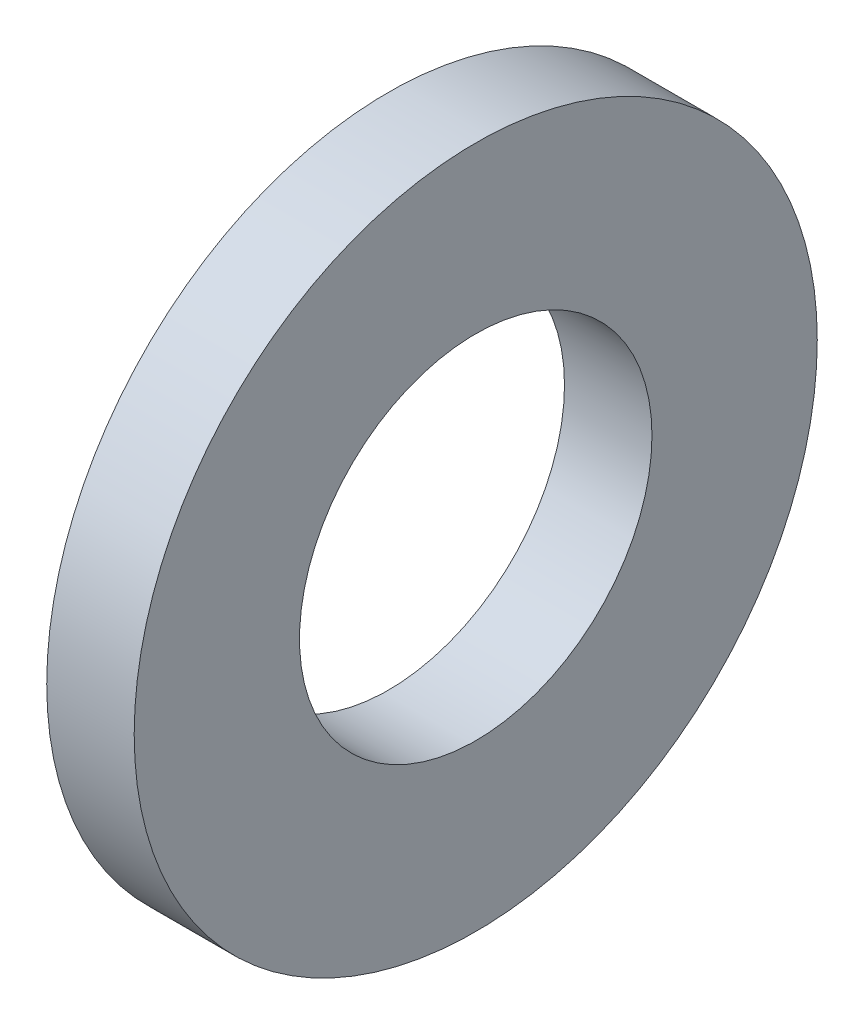
ISO-10303-21;
HEADER;
FILE_DESCRIPTION(('STEP AP214'),'2;1');
FILE_NAME('part.step','',(''),(''),'','','');
FILE_SCHEMA(('AUTOMOTIVE_DESIGN { 1 0 10303 214 1 1 1 1 }'));
ENDSEC;
DATA;
#1=APPLICATION_CONTEXT('core data for automotive mechanical design processes');
#2=APPLICATION_PROTOCOL_DEFINITION('international standard','automotive_design',2000,#1);
#3=PRODUCT_CONTEXT('',#1,'mechanical');
#4=PRODUCT('Part','Part','',(#3));
#5=PRODUCT_RELATED_PRODUCT_CATEGORY('part','',(#4));
#6=PRODUCT_DEFINITION_FORMATION('','',#4);
#7=PRODUCT_DEFINITION_CONTEXT('part definition',#1,'design');
#8=PRODUCT_DEFINITION('design','',#6,#7);
#9=PRODUCT_DEFINITION_SHAPE('','',#8);
#10=(LENGTH_UNIT() NAMED_UNIT(*) SI_UNIT(.MILLI.,.METRE.));
#11=(NAMED_UNIT(*) PLANE_ANGLE_UNIT() SI_UNIT($,.RADIAN.));
#12=(NAMED_UNIT(*) SI_UNIT($,.STERADIAN.) SOLID_ANGLE_UNIT());
#13=UNCERTAINTY_MEASURE_WITH_UNIT(LENGTH_MEASURE(1.E-05),#10,'distance_accuracy_value','');
#14=(GEOMETRIC_REPRESENTATION_CONTEXT(3) GLOBAL_UNCERTAINTY_ASSIGNED_CONTEXT((#13)) GLOBAL_UNIT_ASSIGNED_CONTEXT((#10,
#11,#12)) REPRESENTATION_CONTEXT('',''));
#15=CARTESIAN_POINT('',(0.,0.,0.));
#16=DIRECTION('',(0.,0.,1.));
#17=DIRECTION('',(1.,0.,0.));
#18=AXIS2_PLACEMENT_3D('',#15,#16,#17);
#19=CARTESIAN_POINT('',(1.,0.,0.));
#20=DIRECTION('',(1.,0.,0.));
#21=DIRECTION('',(0.,0.,-1.));
#22=AXIS2_PLACEMENT_3D('',#19,#20,#21);
#23=PLANE('',#22);
#24=CARTESIAN_POINT('',(1.,0.,0.));
#25=DIRECTION('',(1.,0.,0.));
#26=DIRECTION('',(0.,0.,-1.));
#27=AXIS2_PLACEMENT_3D('',#24,#25,#26);
#28=CIRCLE('',#27,3.905);
#29=CARTESIAN_POINT('',(1.,0.,-3.905));
#30=VERTEX_POINT('',#29);
#31=EDGE_CURVE('E10',#30,#30,#28,.T.);
#32=ORIENTED_EDGE('',*,*,#31,.T.);
#33=EDGE_LOOP('',(#32));
#34=FACE_BOUND('',#33,.T.);
#35=CARTESIAN_POINT('',(1.,0.,0.));
#36=DIRECTION('',(1.,0.,0.));
#37=DIRECTION('',(0.,0.,-1.));
#38=AXIS2_PLACEMENT_3D('',#35,#36,#37);
#39=CIRCLE('',#38,2.015);
#40=CARTESIAN_POINT('',(1.,0.,-2.015));
#41=VERTEX_POINT('',#40);
#42=EDGE_CURVE('E39',#41,#41,#39,.T.);
#43=ORIENTED_EDGE('',*,*,#42,.F.);
#44=EDGE_LOOP('',(#43));
#45=FACE_BOUND('',#44,.T.);
#46=ADVANCED_FACE('F28',(#34,#45),#23,.T.);
#47=CARTESIAN_POINT('',(0.,0.,0.));
#48=DIRECTION('',(1.,0.,0.));
#49=DIRECTION('',(0.,0.,-1.));
#50=AXIS2_PLACEMENT_3D('',#47,#48,#49);
#51=PLANE('',#50);
#52=CARTESIAN_POINT('',(0.,0.,0.));
#53=DIRECTION('',(1.,0.,0.));
#54=DIRECTION('',(0.,0.,-1.));
#55=AXIS2_PLACEMENT_3D('',#52,#53,#54);
#56=CIRCLE('',#55,3.905);
#57=CARTESIAN_POINT('',(0.,0.,-3.905));
#58=VERTEX_POINT('',#57);
#59=EDGE_CURVE('E32',#58,#58,#56,.T.);
#60=ORIENTED_EDGE('',*,*,#59,.F.);
#61=EDGE_LOOP('',(#60));
#62=FACE_BOUND('',#61,.T.);
#63=CARTESIAN_POINT('',(0.,0.,0.));
#64=DIRECTION('',(1.,0.,0.));
#65=DIRECTION('',(0.,0.,-1.));
#66=AXIS2_PLACEMENT_3D('',#63,#64,#65);
#67=CIRCLE('',#66,2.015);
#68=CARTESIAN_POINT('',(0.,0.,-2.015));
#69=VERTEX_POINT('',#68);
#70=EDGE_CURVE('E41',#69,#69,#67,.T.);
#71=ORIENTED_EDGE('',*,*,#70,.T.);
#72=EDGE_LOOP('',(#71));
#73=FACE_BOUND('',#72,.T.);
#74=ADVANCED_FACE('F51',(#62,#73),#51,.F.);
#75=CARTESIAN_POINT('',(1.,0.,0.));
#76=DIRECTION('',(-1.,0.,0.));
#77=DIRECTION('',(0.,0.,1.));
#78=AXIS2_PLACEMENT_3D('',#75,#76,#77);
#79=CYLINDRICAL_SURFACE('',#78,3.905);
#80=ORIENTED_EDGE('',*,*,#31,.F.);
#81=EDGE_LOOP('',(#80));
#82=FACE_BOUND('',#81,.T.);
#83=ORIENTED_EDGE('',*,*,#59,.T.);
#84=EDGE_LOOP('',(#83));
#85=FACE_BOUND('',#84,.T.);
#86=ADVANCED_FACE('F30',(#82,#85),#79,.T.);
#87=CARTESIAN_POINT('',(1.,0.,0.));
#88=DIRECTION('',(-1.,0.,0.));
#89=DIRECTION('',(0.,0.,1.));
#90=AXIS2_PLACEMENT_3D('',#87,#88,#89);
#91=CYLINDRICAL_SURFACE('',#90,2.015);
#92=ORIENTED_EDGE('',*,*,#42,.T.);
#93=EDGE_LOOP('',(#92));
#94=FACE_BOUND('',#93,.T.);
#95=ORIENTED_EDGE('',*,*,#70,.F.);
#96=EDGE_LOOP('',(#95));
#97=FACE_BOUND('',#96,.T.);
#98=ADVANCED_FACE('F47',(#94,#97),#91,.F.);
#99=CLOSED_SHELL('',(#46,#74,#86,#98));
#100=MANIFOLD_SOLID_BREP('B2',#99);
#101=ADVANCED_BREP_SHAPE_REPRESENTATION('',(#18,#100),#14);
#102=SHAPE_DEFINITION_REPRESENTATION(#9,#101);
ENDSEC;
END-ISO-10303-21;
